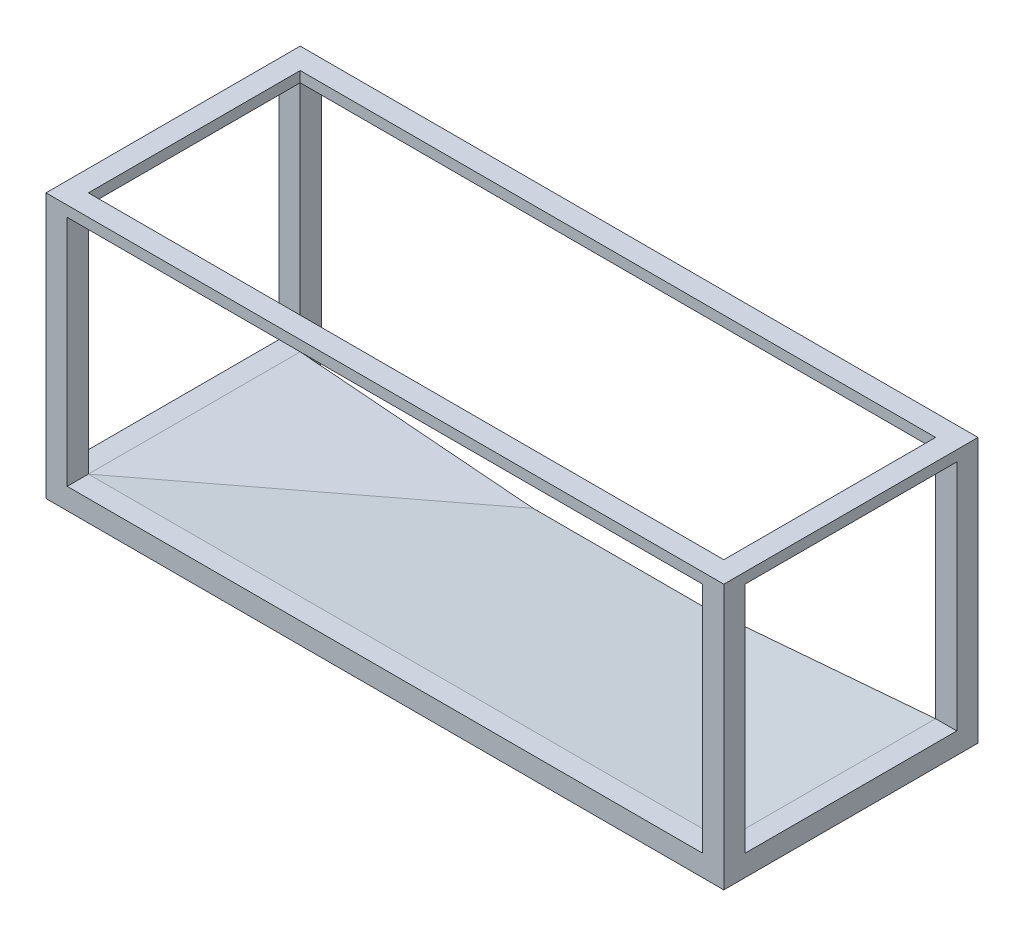
ISO-10303-21;
HEADER;
FILE_DESCRIPTION(('STEP AP214'),'2;1');
FILE_NAME('part.step','',(''),(''),'','','');
FILE_SCHEMA(('AUTOMOTIVE_DESIGN { 1 0 10303 214 1 1 1 1 }'));
ENDSEC;
DATA;
#1=APPLICATION_CONTEXT('core data for automotive mechanical design processes');
#2=APPLICATION_PROTOCOL_DEFINITION('international standard','automotive_design',2000,#1);
#3=PRODUCT_CONTEXT('',#1,'mechanical');
#4=PRODUCT('Part','Part','',(#3));
#5=PRODUCT_RELATED_PRODUCT_CATEGORY('part','',(#4));
#6=PRODUCT_DEFINITION_FORMATION('','',#4);
#7=PRODUCT_DEFINITION_CONTEXT('part definition',#1,'design');
#8=PRODUCT_DEFINITION('design','',#6,#7);
#9=PRODUCT_DEFINITION_SHAPE('','',#8);
#10=(LENGTH_UNIT() NAMED_UNIT(*) SI_UNIT(.MILLI.,.METRE.));
#11=(NAMED_UNIT(*) PLANE_ANGLE_UNIT() SI_UNIT($,.RADIAN.));
#12=(NAMED_UNIT(*) SI_UNIT($,.STERADIAN.) SOLID_ANGLE_UNIT());
#13=UNCERTAINTY_MEASURE_WITH_UNIT(LENGTH_MEASURE(1.E-05),#10,'distance_accuracy_value','');
#14=(GEOMETRIC_REPRESENTATION_CONTEXT(3) GLOBAL_UNCERTAINTY_ASSIGNED_CONTEXT((#13)) GLOBAL_UNIT_ASSIGNED_CONTEXT((#10,
#11,#12)) REPRESENTATION_CONTEXT('',''));
#15=CARTESIAN_POINT('',(0.,0.,0.));
#16=DIRECTION('',(0.,0.,1.));
#17=DIRECTION('',(1.,0.,0.));
#18=AXIS2_PLACEMENT_3D('',#15,#16,#17);
#19=CARTESIAN_POINT('',(-190.5,12.7,63.5));
#20=DIRECTION('',(1.,0.,0.));
#21=DIRECTION('',(0.,0.,-1.));
#22=AXIS2_PLACEMENT_3D('',#19,#20,#21);
#23=PLANE('',#22);
#24=DIRECTION('',(0.,-1.,0.));
#25=VECTOR('',#24,1.);
#26=CARTESIAN_POINT('',(-190.5,158.75,-63.5));
#27=LINE('',#26,#25);
#28=CARTESIAN_POINT('',(-190.5,152.4,-63.5));
#29=VERTEX_POINT('',#28);
#30=CARTESIAN_POINT('',(-190.5,12.7,-63.5));
#31=VERTEX_POINT('',#30);
#32=EDGE_CURVE('E214',#29,#31,#27,.T.);
#33=ORIENTED_EDGE('',*,*,#32,.T.);
#34=DIRECTION('',(0.,1.,0.));
#35=VECTOR('',#34,1.);
#36=CARTESIAN_POINT('',(-190.5,12.7,-63.4999999999999));
#37=LINE('',#36,#35);
#38=CARTESIAN_POINT('',(-190.5,0.,-63.4999999999999));
#39=VERTEX_POINT('',#38);
#40=EDGE_CURVE('E198',#39,#31,#37,.T.);
#41=ORIENTED_EDGE('',*,*,#40,.F.);
#42=DIRECTION('',(0.,0.,1.));
#43=VECTOR('',#42,1.);
#44=CARTESIAN_POINT('',(-190.5,0.,63.5));
#45=LINE('',#44,#43);
#46=CARTESIAN_POINT('',(-190.5,0.,-76.2));
#47=VERTEX_POINT('',#46);
#48=EDGE_CURVE('E336',#47,#39,#45,.T.);
#49=ORIENTED_EDGE('',*,*,#48,.F.);
#50=DIRECTION('',(0.,-1.,0.));
#51=VECTOR('',#50,1.);
#52=CARTESIAN_POINT('',(-190.5,158.75,-76.2));
#53=LINE('',#52,#51);
#54=CARTESIAN_POINT('',(-190.5,152.4,-76.2));
#55=VERTEX_POINT('',#54);
#56=EDGE_CURVE('E266',#55,#47,#53,.T.);
#57=ORIENTED_EDGE('',*,*,#56,.F.);
#58=DIRECTION('',(0.,0.,1.));
#59=VECTOR('',#58,1.);
#60=CARTESIAN_POINT('',(-190.5,152.4,0.));
#61=LINE('',#60,#59);
#62=EDGE_CURVE('E216',#55,#29,#61,.T.);
#63=ORIENTED_EDGE('',*,*,#62,.T.);
#64=EDGE_LOOP('',(#33,#41,#49,#57,#63));
#65=FACE_BOUND('',#64,.T.);
#66=ADVANCED_FACE('F61',(#65),#23,.T.);
#67=CARTESIAN_POINT('',(190.5,12.7,63.5));
#68=DIRECTION('',(-1.,0.,0.));
#69=DIRECTION('',(0.,0.,1.));
#70=AXIS2_PLACEMENT_3D('',#67,#68,#69);
#71=PLANE('',#70);
#72=DIRECTION('',(0.,0.,-1.));
#73=VECTOR('',#72,1.);
#74=CARTESIAN_POINT('',(190.5,0.,63.5));
#75=LINE('',#74,#73);
#76=CARTESIAN_POINT('',(190.5,0.,-63.5000000000001));
#77=VERTEX_POINT('',#76);
#78=CARTESIAN_POINT('',(190.5,0.,-76.2));
#79=VERTEX_POINT('',#78);
#80=EDGE_CURVE('E253',#77,#79,#75,.T.);
#81=ORIENTED_EDGE('',*,*,#80,.F.);
#82=DIRECTION('',(0.,-1.,0.));
#83=VECTOR('',#82,1.);
#84=CARTESIAN_POINT('',(190.5,12.7,-63.5));
#85=LINE('',#84,#83);
#86=CARTESIAN_POINT('',(190.5,12.7,-63.5));
#87=VERTEX_POINT('',#86);
#88=EDGE_CURVE('E211',#87,#77,#85,.T.);
#89=ORIENTED_EDGE('',*,*,#88,.F.);
#90=DIRECTION('',(0.,-1.,0.));
#91=VECTOR('',#90,1.);
#92=CARTESIAN_POINT('',(190.5,158.75,-63.5));
#93=LINE('',#92,#91);
#94=CARTESIAN_POINT('',(190.5,152.4,-63.5));
#95=VERTEX_POINT('',#94);
#96=EDGE_CURVE('E314',#95,#87,#93,.T.);
#97=ORIENTED_EDGE('',*,*,#96,.F.);
#98=DIRECTION('',(0.,0.,1.));
#99=VECTOR('',#98,1.);
#100=CARTESIAN_POINT('',(190.5,152.4,0.));
#101=LINE('',#100,#99);
#102=CARTESIAN_POINT('',(190.5,152.4,-76.2));
#103=VERTEX_POINT('',#102);
#104=EDGE_CURVE('E487',#103,#95,#101,.T.);
#105=ORIENTED_EDGE('',*,*,#104,.F.);
#106=DIRECTION('',(0.,-1.,0.));
#107=VECTOR('',#106,1.);
#108=CARTESIAN_POINT('',(190.5,158.75,-76.2));
#109=LINE('',#108,#107);
#110=EDGE_CURVE('E399',#103,#79,#109,.T.);
#111=ORIENTED_EDGE('',*,*,#110,.T.);
#112=EDGE_LOOP('',(#81,#89,#97,#105,#111));
#113=FACE_BOUND('',#112,.T.);
#114=ADVANCED_FACE('F591',(#113),#71,.T.);
#115=CARTESIAN_POINT('',(0.,12.7,0.));
#116=DIRECTION('',(0.,-1.,0.));
#117=DIRECTION('',(0.,0.,-1.));
#118=AXIS2_PLACEMENT_3D('',#115,#116,#117);
#119=PLANE('',#118);
#120=DIRECTION('',(1.,0.,0.));
#121=VECTOR('',#120,1.);
#122=CARTESIAN_POINT('',(0.,12.7,-63.5));
#123=LINE('',#122,#121);
#124=CARTESIAN_POINT('',(203.2,12.7,-63.5));
#125=VERTEX_POINT('',#124);
#126=EDGE_CURVE('E395',#87,#125,#123,.T.);
#127=ORIENTED_EDGE('',*,*,#126,.F.);
#128=DIRECTION('',(0.,0.,-1.));
#129=VECTOR('',#128,1.);
#130=CARTESIAN_POINT('',(190.5,12.7,63.5));
#131=LINE('',#130,#129);
#132=CARTESIAN_POINT('',(190.5,12.7,63.5));
#133=VERTEX_POINT('',#132);
#134=EDGE_CURVE('E236',#133,#87,#131,.T.);
#135=ORIENTED_EDGE('',*,*,#134,.F.);
#136=DIRECTION('',(1.,0.,0.));
#137=VECTOR('',#136,1.);
#138=CARTESIAN_POINT('',(0.,12.7,63.5));
#139=LINE('',#138,#137);
#140=CARTESIAN_POINT('',(203.2,12.7,63.5));
#141=VERTEX_POINT('',#140);
#142=EDGE_CURVE('E298',#133,#141,#139,.T.);
#143=ORIENTED_EDGE('',*,*,#142,.T.);
#144=DIRECTION('',(0.,0.,-1.));
#145=VECTOR('',#144,1.);
#146=CARTESIAN_POINT('',(203.2,12.7,76.2));
#147=LINE('',#146,#145);
#148=EDGE_CURVE('E353',#141,#125,#147,.T.);
#149=ORIENTED_EDGE('',*,*,#148,.T.);
#150=EDGE_LOOP('',(#127,#135,#143,#149));
#151=FACE_BOUND('',#150,.T.);
#152=ADVANCED_FACE('F595',(#151),#119,.F.);
#153=DIRECTION('',(0.,0.,1.));
#154=VECTOR('',#153,1.);
#155=CARTESIAN_POINT('',(190.5,12.7,0.));
#156=LINE('',#155,#154);
#157=CARTESIAN_POINT('',(190.5,12.7,76.2));
#158=VERTEX_POINT('',#157);
#159=EDGE_CURVE('E308',#133,#158,#156,.T.);
#160=ORIENTED_EDGE('',*,*,#159,.F.);
#161=DIRECTION('',(1.,0.,0.));
#162=VECTOR('',#161,1.);
#163=CARTESIAN_POINT('',(-190.5,12.7,63.5));
#164=LINE('',#163,#162);
#165=CARTESIAN_POINT('',(-190.5,12.7,63.5));
#166=VERTEX_POINT('',#165);
#167=EDGE_CURVE('E235',#166,#133,#164,.T.);
#168=ORIENTED_EDGE('',*,*,#167,.F.);
#169=DIRECTION('',(0.,0.,1.));
#170=VECTOR('',#169,1.);
#171=CARTESIAN_POINT('',(-190.5,12.7,0.));
#172=LINE('',#171,#170);
#173=CARTESIAN_POINT('',(-190.5,12.7,76.2));
#174=VERTEX_POINT('',#173);
#175=EDGE_CURVE('E260',#166,#174,#172,.T.);
#176=ORIENTED_EDGE('',*,*,#175,.T.);
#177=DIRECTION('',(1.,0.,0.));
#178=VECTOR('',#177,1.);
#179=CARTESIAN_POINT('',(-203.2,12.7,76.2));
#180=LINE('',#179,#178);
#181=EDGE_CURVE('E348',#174,#158,#180,.T.);
#182=ORIENTED_EDGE('',*,*,#181,.T.);
#183=EDGE_LOOP('',(#160,#168,#176,#182));
#184=FACE_BOUND('',#183,.T.);
#185=ADVANCED_FACE('F547',(#184),#119,.F.);
#186=DIRECTION('',(0.,0.,1.));
#187=VECTOR('',#186,1.);
#188=CARTESIAN_POINT('',(-190.5,12.7,-63.4999999999999));
#189=LINE('',#188,#187);
#190=EDGE_CURVE('E195',#31,#166,#189,.T.);
#191=ORIENTED_EDGE('',*,*,#190,.F.);
#192=DIRECTION('',(-1.,0.,0.));
#193=VECTOR('',#192,1.);
#194=CARTESIAN_POINT('',(0.,12.7,-63.5));
#195=LINE('',#194,#193);
#196=CARTESIAN_POINT('',(-203.2,12.7,-63.4999999999999));
#197=VERTEX_POINT('',#196);
#198=EDGE_CURVE('E229',#31,#197,#195,.T.);
#199=ORIENTED_EDGE('',*,*,#198,.T.);
#200=DIRECTION('',(0.,0.,1.));
#201=VECTOR('',#200,1.);
#202=CARTESIAN_POINT('',(-203.2,12.7,76.2));
#203=LINE('',#202,#201);
#204=CARTESIAN_POINT('',(-203.2,12.7,63.5));
#205=VERTEX_POINT('',#204);
#206=EDGE_CURVE('E345',#197,#205,#203,.T.);
#207=ORIENTED_EDGE('',*,*,#206,.T.);
#208=DIRECTION('',(-1.,0.,0.));
#209=VECTOR('',#208,1.);
#210=CARTESIAN_POINT('',(0.,12.7,63.5));
#211=LINE('',#210,#209);
#212=EDGE_CURVE('E232',#166,#205,#211,.T.);
#213=ORIENTED_EDGE('',*,*,#212,.F.);
#214=EDGE_LOOP('',(#191,#199,#207,#213));
#215=FACE_BOUND('',#214,.T.);
#216=ADVANCED_FACE('F227',(#215),#119,.F.);
#217=CARTESIAN_POINT('',(0.,0.,0.));
#218=DIRECTION('',(0.,-1.,0.));
#219=DIRECTION('',(0.,0.,-1.));
#220=AXIS2_PLACEMENT_3D('',#217,#218,#219);
#221=PLANE('',#220);
#222=ORIENTED_EDGE('',*,*,#48,.T.);
#223=DIRECTION('',(1.,0.,0.));
#224=VECTOR('',#223,1.);
#225=CARTESIAN_POINT('',(-318.133420388235,0.,-63.5));
#226=LINE('',#225,#224);
#227=EDGE_CURVE('E79',#39,#77,#226,.T.);
#228=ORIENTED_EDGE('',*,*,#227,.T.);
#229=ORIENTED_EDGE('',*,*,#80,.T.);
#230=DIRECTION('',(-1.,0.,0.));
#231=VECTOR('',#230,1.);
#232=CARTESIAN_POINT('',(-203.2,0.,-76.2));
#233=LINE('',#232,#231);
#234=CARTESIAN_POINT('',(203.2,0.,-76.2));
#235=VERTEX_POINT('',#234);
#236=EDGE_CURVE('E349',#235,#79,#233,.T.);
#237=ORIENTED_EDGE('',*,*,#236,.F.);
#238=DIRECTION('',(0.,0.,-1.));
#239=VECTOR('',#238,1.);
#240=CARTESIAN_POINT('',(203.2,0.,76.2));
#241=LINE('',#240,#239);
#242=CARTESIAN_POINT('',(203.2,0.,76.2));
#243=VERTEX_POINT('',#242);
#244=EDGE_CURVE('E365',#243,#235,#241,.T.);
#245=ORIENTED_EDGE('',*,*,#244,.F.);
#246=DIRECTION('',(1.,0.,0.));
#247=VECTOR('',#246,1.);
#248=CARTESIAN_POINT('',(-203.2,0.,76.2));
#249=LINE('',#248,#247);
#250=CARTESIAN_POINT('',(-203.2,0.,76.2));
#251=VERTEX_POINT('',#250);
#252=EDGE_CURVE('E361',#251,#243,#249,.T.);
#253=ORIENTED_EDGE('',*,*,#252,.F.);
#254=DIRECTION('',(0.,0.,1.));
#255=VECTOR('',#254,1.);
#256=CARTESIAN_POINT('',(-203.2,0.,76.2));
#257=LINE('',#256,#255);
#258=CARTESIAN_POINT('',(-203.2,0.,-76.2));
#259=VERTEX_POINT('',#258);
#260=EDGE_CURVE('E325',#259,#251,#257,.T.);
#261=ORIENTED_EDGE('',*,*,#260,.F.);
#262=EDGE_CURVE('E369',#47,#259,#233,.T.);
#263=ORIENTED_EDGE('',*,*,#262,.F.);
#264=EDGE_LOOP('',(#222,#228,#229,#237,#245,#253,#261,#263));
#265=FACE_BOUND('',#264,.T.);
#266=ADVANCED_FACE('F607',(#265),#221,.T.);
#267=CARTESIAN_POINT('',(-203.2,12.7,76.2));
#268=DIRECTION('',(1.,0.,0.));
#269=DIRECTION('',(0.,0.,-1.));
#270=AXIS2_PLACEMENT_3D('',#267,#268,#269);
#271=PLANE('',#270);
#272=DIRECTION('',(0.,0.,1.));
#273=VECTOR('',#272,1.);
#274=CARTESIAN_POINT('',(-203.2,152.4,76.2));
#275=LINE('',#274,#273);
#276=CARTESIAN_POINT('',(-203.2,152.4,-63.5));
#277=VERTEX_POINT('',#276);
#278=CARTESIAN_POINT('',(-203.2,152.4,63.5));
#279=VERTEX_POINT('',#278);
#280=EDGE_CURVE('E462',#277,#279,#275,.T.);
#281=ORIENTED_EDGE('',*,*,#280,.T.);
#282=DIRECTION('',(0.,-1.,0.));
#283=VECTOR('',#282,1.);
#284=CARTESIAN_POINT('',(-203.2,158.75,63.5));
#285=LINE('',#284,#283);
#286=EDGE_CURVE('E254',#279,#205,#285,.T.);
#287=ORIENTED_EDGE('',*,*,#286,.T.);
#288=ORIENTED_EDGE('',*,*,#206,.F.);
#289=DIRECTION('',(0.,-1.,0.));
#290=VECTOR('',#289,1.);
#291=CARTESIAN_POINT('',(-203.2,158.75,-63.5));
#292=LINE('',#291,#290);
#293=EDGE_CURVE('E221',#277,#197,#292,.T.);
#294=ORIENTED_EDGE('',*,*,#293,.F.);
#295=EDGE_LOOP('',(#281,#287,#288,#294));
#296=FACE_BOUND('',#295,.T.);
#297=ORIENTED_EDGE('',*,*,#260,.T.);
#298=DIRECTION('',(0.,-1.,0.));
#299=VECTOR('',#298,1.);
#300=CARTESIAN_POINT('',(-203.2,12.7,76.2));
#301=LINE('',#300,#299);
#302=CARTESIAN_POINT('',(-203.2,158.75,76.2));
#303=VERTEX_POINT('',#302);
#304=EDGE_CURVE('E382',#303,#251,#301,.T.);
#305=ORIENTED_EDGE('',*,*,#304,.F.);
#306=DIRECTION('',(0.,0.,1.));
#307=VECTOR('',#306,1.);
#308=CARTESIAN_POINT('',(-203.2,158.75,0.));
#309=LINE('',#308,#307);
#310=CARTESIAN_POINT('',(-203.2,158.75,-76.2));
#311=VERTEX_POINT('',#310);
#312=EDGE_CURVE('E259',#311,#303,#309,.T.);
#313=ORIENTED_EDGE('',*,*,#312,.F.);
#314=DIRECTION('',(0.,-1.,0.));
#315=VECTOR('',#314,1.);
#316=CARTESIAN_POINT('',(-203.2,12.7,-76.2));
#317=LINE('',#316,#315);
#318=EDGE_CURVE('E357',#311,#259,#317,.T.);
#319=ORIENTED_EDGE('',*,*,#318,.T.);
#320=EDGE_LOOP('',(#297,#305,#313,#319));
#321=FACE_BOUND('',#320,.T.);
#322=ADVANCED_FACE('F63',(#296,#321),#271,.F.);
#323=CARTESIAN_POINT('',(-203.2,12.7,76.2));
#324=DIRECTION('',(0.,0.,-1.));
#325=DIRECTION('',(-1.,0.,0.));
#326=AXIS2_PLACEMENT_3D('',#323,#324,#325);
#327=PLANE('',#326);
#328=DIRECTION('',(1.,0.,0.));
#329=VECTOR('',#328,1.);
#330=CARTESIAN_POINT('',(-203.2,152.4,76.2));
#331=LINE('',#330,#329);
#332=CARTESIAN_POINT('',(-190.5,152.4,76.2));
#333=VERTEX_POINT('',#332);
#334=CARTESIAN_POINT('',(190.5,152.4,76.2));
#335=VERTEX_POINT('',#334);
#336=EDGE_CURVE('E475',#333,#335,#331,.T.);
#337=ORIENTED_EDGE('',*,*,#336,.T.);
#338=DIRECTION('',(0.,-1.,0.));
#339=VECTOR('',#338,1.);
#340=CARTESIAN_POINT('',(190.5,158.75,76.2));
#341=LINE('',#340,#339);
#342=EDGE_CURVE('E240',#335,#158,#341,.T.);
#343=ORIENTED_EDGE('',*,*,#342,.T.);
#344=ORIENTED_EDGE('',*,*,#181,.F.);
#345=DIRECTION('',(0.,-1.,0.));
#346=VECTOR('',#345,1.);
#347=CARTESIAN_POINT('',(-190.5,158.75,76.2));
#348=LINE('',#347,#346);
#349=EDGE_CURVE('E529',#333,#174,#348,.T.);
#350=ORIENTED_EDGE('',*,*,#349,.F.);
#351=EDGE_LOOP('',(#337,#343,#344,#350));
#352=FACE_BOUND('',#351,.T.);
#353=ORIENTED_EDGE('',*,*,#252,.T.);
#354=DIRECTION('',(0.,-1.,0.));
#355=VECTOR('',#354,1.);
#356=CARTESIAN_POINT('',(203.2,12.7,76.2));
#357=LINE('',#356,#355);
#358=CARTESIAN_POINT('',(203.2,158.75,76.2));
#359=VERTEX_POINT('',#358);
#360=EDGE_CURVE('E379',#359,#243,#357,.T.);
#361=ORIENTED_EDGE('',*,*,#360,.F.);
#362=DIRECTION('',(1.,0.,0.));
#363=VECTOR('',#362,1.);
#364=CARTESIAN_POINT('',(0.,158.75,76.2));
#365=LINE('',#364,#363);
#366=EDGE_CURVE('E526',#303,#359,#365,.T.);
#367=ORIENTED_EDGE('',*,*,#366,.F.);
#368=ORIENTED_EDGE('',*,*,#304,.T.);
#369=EDGE_LOOP('',(#353,#361,#367,#368));
#370=FACE_BOUND('',#369,.T.);
#371=ADVANCED_FACE('F549',(#352,#370),#327,.F.);
#372=CARTESIAN_POINT('',(203.2,12.7,76.2));
#373=DIRECTION('',(-1.,0.,0.));
#374=DIRECTION('',(0.,0.,1.));
#375=AXIS2_PLACEMENT_3D('',#372,#373,#374);
#376=PLANE('',#375);
#377=DIRECTION('',(0.,0.,-1.));
#378=VECTOR('',#377,1.);
#379=CARTESIAN_POINT('',(203.2,152.4,76.2));
#380=LINE('',#379,#378);
#381=CARTESIAN_POINT('',(203.2,152.4,63.5));
#382=VERTEX_POINT('',#381);
#383=CARTESIAN_POINT('',(203.2,152.4,-63.5));
#384=VERTEX_POINT('',#383);
#385=EDGE_CURVE('E479',#382,#384,#380,.T.);
#386=ORIENTED_EDGE('',*,*,#385,.T.);
#387=DIRECTION('',(0.,-1.,0.));
#388=VECTOR('',#387,1.);
#389=CARTESIAN_POINT('',(203.2,158.75,-63.5));
#390=LINE('',#389,#388);
#391=EDGE_CURVE('E394',#384,#125,#390,.T.);
#392=ORIENTED_EDGE('',*,*,#391,.T.);
#393=ORIENTED_EDGE('',*,*,#148,.F.);
#394=DIRECTION('',(0.,-1.,0.));
#395=VECTOR('',#394,1.);
#396=CARTESIAN_POINT('',(203.2,158.75,63.5));
#397=LINE('',#396,#395);
#398=EDGE_CURVE('E245',#382,#141,#397,.T.);
#399=ORIENTED_EDGE('',*,*,#398,.F.);
#400=EDGE_LOOP('',(#386,#392,#393,#399));
#401=FACE_BOUND('',#400,.T.);
#402=ORIENTED_EDGE('',*,*,#244,.T.);
#403=DIRECTION('',(0.,-1.,0.));
#404=VECTOR('',#403,1.);
#405=CARTESIAN_POINT('',(203.2,12.7,-76.2));
#406=LINE('',#405,#404);
#407=CARTESIAN_POINT('',(203.2,158.75,-76.2));
#408=VERTEX_POINT('',#407);
#409=EDGE_CURVE('E376',#408,#235,#406,.T.);
#410=ORIENTED_EDGE('',*,*,#409,.F.);
#411=DIRECTION('',(0.,0.,1.));
#412=VECTOR('',#411,1.);
#413=CARTESIAN_POINT('',(203.2,158.75,0.));
#414=LINE('',#413,#412);
#415=EDGE_CURVE('E307',#408,#359,#414,.T.);
#416=ORIENTED_EDGE('',*,*,#415,.T.);
#417=ORIENTED_EDGE('',*,*,#360,.T.);
#418=EDGE_LOOP('',(#402,#410,#416,#417));
#419=FACE_BOUND('',#418,.T.);
#420=ADVANCED_FACE('F618',(#401,#419),#376,.F.);
#421=CARTESIAN_POINT('',(-203.2,12.7,-76.2));
#422=DIRECTION('',(0.,0.,1.));
#423=DIRECTION('',(1.,0.,0.));
#424=AXIS2_PLACEMENT_3D('',#421,#422,#423);
#425=PLANE('',#424);
#426=ORIENTED_EDGE('',*,*,#236,.T.);
#427=ORIENTED_EDGE('',*,*,#110,.F.);
#428=DIRECTION('',(-1.,0.,0.));
#429=VECTOR('',#428,1.);
#430=CARTESIAN_POINT('',(-203.2,152.4,-76.2));
#431=LINE('',#430,#429);
#432=EDGE_CURVE('E483',#103,#55,#431,.T.);
#433=ORIENTED_EDGE('',*,*,#432,.T.);
#434=ORIENTED_EDGE('',*,*,#56,.T.);
#435=ORIENTED_EDGE('',*,*,#262,.T.);
#436=ORIENTED_EDGE('',*,*,#318,.F.);
#437=DIRECTION('',(1.,0.,0.));
#438=VECTOR('',#437,1.);
#439=CARTESIAN_POINT('',(0.,158.75,-76.2));
#440=LINE('',#439,#438);
#441=EDGE_CURVE('E222',#311,#408,#440,.T.);
#442=ORIENTED_EDGE('',*,*,#441,.T.);
#443=ORIENTED_EDGE('',*,*,#409,.T.);
#444=EDGE_LOOP('',(#426,#427,#433,#434,#435,#436,#442,#443));
#445=FACE_BOUND('',#444,.T.);
#446=ADVANCED_FACE('F602',(#445),#425,.F.);
#447=CARTESIAN_POINT('',(-190.5,158.75,0.));
#448=DIRECTION('',(1.,0.,0.));
#449=DIRECTION('',(0.,0.,-1.));
#450=AXIS2_PLACEMENT_3D('',#447,#448,#449);
#451=PLANE('',#450);
#452=DIRECTION('',(0.,0.,-1.));
#453=VECTOR('',#452,1.);
#454=CARTESIAN_POINT('',(-190.5,152.4,0.));
#455=LINE('',#454,#453);
#456=CARTESIAN_POINT('',(-190.5,152.4,63.5));
#457=VERTEX_POINT('',#456);
#458=EDGE_CURVE('E400',#333,#457,#455,.T.);
#459=ORIENTED_EDGE('',*,*,#458,.F.);
#460=ORIENTED_EDGE('',*,*,#349,.T.);
#461=ORIENTED_EDGE('',*,*,#175,.F.);
#462=DIRECTION('',(0.,-1.,0.));
#463=VECTOR('',#462,1.);
#464=CARTESIAN_POINT('',(-190.5,158.75,63.5));
#465=LINE('',#464,#463);
#466=EDGE_CURVE('E249',#457,#166,#465,.T.);
#467=ORIENTED_EDGE('',*,*,#466,.F.);
#468=EDGE_LOOP('',(#459,#460,#461,#467));
#469=FACE_BOUND('',#468,.T.);
#470=ADVANCED_FACE('F542',(#469),#451,.T.);
#471=CARTESIAN_POINT('',(0.,158.75,63.5));
#472=DIRECTION('',(0.,0.,1.));
#473=DIRECTION('',(1.,0.,0.));
#474=AXIS2_PLACEMENT_3D('',#471,#472,#473);
#475=PLANE('',#474);
#476=ORIENTED_EDGE('',*,*,#286,.F.);
#477=DIRECTION('',(1.,0.,0.));
#478=VECTOR('',#477,1.);
#479=CARTESIAN_POINT('',(0.,152.4,63.5));
#480=LINE('',#479,#478);
#481=EDGE_CURVE('E502',#279,#457,#480,.T.);
#482=ORIENTED_EDGE('',*,*,#481,.T.);
#483=ORIENTED_EDGE('',*,*,#466,.T.);
#484=ORIENTED_EDGE('',*,*,#212,.T.);
#485=EDGE_LOOP('',(#476,#482,#483,#484));
#486=FACE_BOUND('',#485,.T.);
#487=ADVANCED_FACE('F537',(#486),#475,.F.);
#488=CARTESIAN_POINT('',(0.,158.75,0.));
#489=DIRECTION('',(0.,1.,0.));
#490=DIRECTION('',(0.,0.,1.));
#491=AXIS2_PLACEMENT_3D('',#488,#489,#490);
#492=PLANE('',#491);
#493=ORIENTED_EDGE('',*,*,#366,.T.);
#494=ORIENTED_EDGE('',*,*,#415,.F.);
#495=ORIENTED_EDGE('',*,*,#441,.F.);
#496=ORIENTED_EDGE('',*,*,#312,.T.);
#497=EDGE_LOOP('',(#493,#494,#495,#496));
#498=FACE_BOUND('',#497,.T.);
#499=DIRECTION('',(1.,0.,0.));
#500=VECTOR('',#499,1.);
#501=CARTESIAN_POINT('',(-190.5,158.75,63.5));
#502=LINE('',#501,#500);
#503=CARTESIAN_POINT('',(-190.5,158.75,63.5));
#504=VERTEX_POINT('',#503);
#505=CARTESIAN_POINT('',(190.5,158.75,63.5));
#506=VERTEX_POINT('',#505);
#507=EDGE_CURVE('E403',#504,#506,#502,.T.);
#508=ORIENTED_EDGE('',*,*,#507,.F.);
#509=DIRECTION('',(0.,0.,1.));
#510=VECTOR('',#509,1.);
#511=CARTESIAN_POINT('',(-190.5,158.75,63.5));
#512=LINE('',#511,#510);
#513=CARTESIAN_POINT('',(-190.5,158.75,-63.5));
#514=VERTEX_POINT('',#513);
#515=EDGE_CURVE('E433',#514,#504,#512,.T.);
#516=ORIENTED_EDGE('',*,*,#515,.F.);
#517=DIRECTION('',(-1.,0.,0.));
#518=VECTOR('',#517,1.);
#519=CARTESIAN_POINT('',(-190.5,158.75,-63.5));
#520=LINE('',#519,#518);
#521=CARTESIAN_POINT('',(190.5,158.75,-63.5));
#522=VERTEX_POINT('',#521);
#523=EDGE_CURVE('E452',#522,#514,#520,.T.);
#524=ORIENTED_EDGE('',*,*,#523,.F.);
#525=DIRECTION('',(0.,0.,-1.));
#526=VECTOR('',#525,1.);
#527=CARTESIAN_POINT('',(190.5,158.75,63.5));
#528=LINE('',#527,#526);
#529=EDGE_CURVE('E448',#506,#522,#528,.T.);
#530=ORIENTED_EDGE('',*,*,#529,.F.);
#531=EDGE_LOOP('',(#508,#516,#524,#530));
#532=FACE_BOUND('',#531,.T.);
#533=ADVANCED_FACE('F613',(#498,#532),#492,.T.);
#534=CARTESIAN_POINT('',(0.,158.75,-63.5));
#535=DIRECTION('',(0.,0.,1.));
#536=DIRECTION('',(1.,0.,0.));
#537=AXIS2_PLACEMENT_3D('',#534,#535,#536);
#538=PLANE('',#537);
#539=DIRECTION('',(1.,0.,0.));
#540=VECTOR('',#539,1.);
#541=CARTESIAN_POINT('',(0.,152.4,-63.5));
#542=LINE('',#541,#540);
#543=EDGE_CURVE('E497',#277,#29,#542,.T.);
#544=ORIENTED_EDGE('',*,*,#543,.F.);
#545=ORIENTED_EDGE('',*,*,#293,.T.);
#546=ORIENTED_EDGE('',*,*,#198,.F.);
#547=ORIENTED_EDGE('',*,*,#32,.F.);
#548=EDGE_LOOP('',(#544,#545,#546,#547));
#549=FACE_BOUND('',#548,.T.);
#550=ADVANCED_FACE('F237',(#549),#538,.T.);
#551=CARTESIAN_POINT('',(190.5,158.75,0.));
#552=DIRECTION('',(1.,0.,0.));
#553=DIRECTION('',(0.,0.,-1.));
#554=AXIS2_PLACEMENT_3D('',#551,#552,#553);
#555=PLANE('',#554);
#556=ORIENTED_EDGE('',*,*,#342,.F.);
#557=DIRECTION('',(0.,0.,-1.));
#558=VECTOR('',#557,1.);
#559=CARTESIAN_POINT('',(190.5,152.4,0.));
#560=LINE('',#559,#558);
#561=CARTESIAN_POINT('',(190.5,152.4,63.5));
#562=VERTEX_POINT('',#561);
#563=EDGE_CURVE('E494',#335,#562,#560,.T.);
#564=ORIENTED_EDGE('',*,*,#563,.T.);
#565=DIRECTION('',(0.,-1.,0.));
#566=VECTOR('',#565,1.);
#567=CARTESIAN_POINT('',(190.5,158.75,63.5));
#568=LINE('',#567,#566);
#569=EDGE_CURVE('E317',#562,#133,#568,.T.);
#570=ORIENTED_EDGE('',*,*,#569,.T.);
#571=ORIENTED_EDGE('',*,*,#159,.T.);
#572=EDGE_LOOP('',(#556,#564,#570,#571));
#573=FACE_BOUND('',#572,.T.);
#574=ADVANCED_FACE('F553',(#573),#555,.F.);
#575=CARTESIAN_POINT('',(0.,158.75,63.5));
#576=DIRECTION('',(0.,0.,-1.));
#577=DIRECTION('',(-1.,0.,0.));
#578=AXIS2_PLACEMENT_3D('',#575,#576,#577);
#579=PLANE('',#578);
#580=DIRECTION('',(-1.,0.,0.));
#581=VECTOR('',#580,1.);
#582=CARTESIAN_POINT('',(0.,152.4,63.5));
#583=LINE('',#582,#581);
#584=EDGE_CURVE('E490',#382,#562,#583,.T.);
#585=ORIENTED_EDGE('',*,*,#584,.F.);
#586=ORIENTED_EDGE('',*,*,#398,.T.);
#587=ORIENTED_EDGE('',*,*,#142,.F.);
#588=ORIENTED_EDGE('',*,*,#569,.F.);
#589=EDGE_LOOP('',(#585,#586,#587,#588));
#590=FACE_BOUND('',#589,.T.);
#591=ADVANCED_FACE('F883',(#590),#579,.T.);
#592=CARTESIAN_POINT('',(0.,158.75,-63.5));
#593=DIRECTION('',(0.,0.,-1.));
#594=DIRECTION('',(-1.,0.,0.));
#595=AXIS2_PLACEMENT_3D('',#592,#593,#594);
#596=PLANE('',#595);
#597=ORIENTED_EDGE('',*,*,#391,.F.);
#598=DIRECTION('',(-1.,0.,0.));
#599=VECTOR('',#598,1.);
#600=CARTESIAN_POINT('',(0.,152.4,-63.5));
#601=LINE('',#600,#599);
#602=EDGE_CURVE('E385',#384,#95,#601,.T.);
#603=ORIENTED_EDGE('',*,*,#602,.T.);
#604=ORIENTED_EDGE('',*,*,#96,.T.);
#605=ORIENTED_EDGE('',*,*,#126,.T.);
#606=EDGE_LOOP('',(#597,#603,#604,#605));
#607=FACE_BOUND('',#606,.T.);
#608=ADVANCED_FACE('F586',(#607),#596,.F.);
#609=CARTESIAN_POINT('',(0.,152.4,0.));
#610=DIRECTION('',(0.,-1.,0.));
#611=DIRECTION('',(0.,0.,-1.));
#612=AXIS2_PLACEMENT_3D('',#609,#610,#611);
#613=PLANE('',#612);
#614=ORIENTED_EDGE('',*,*,#481,.F.);
#615=ORIENTED_EDGE('',*,*,#280,.F.);
#616=ORIENTED_EDGE('',*,*,#543,.T.);
#617=DIRECTION('',(0.,0.,1.));
#618=VECTOR('',#617,1.);
#619=CARTESIAN_POINT('',(-190.5,152.4,63.5));
#620=LINE('',#619,#618);
#621=EDGE_CURVE('E441',#29,#457,#620,.T.);
#622=ORIENTED_EDGE('',*,*,#621,.T.);
#623=EDGE_LOOP('',(#614,#615,#616,#622));
#624=FACE_BOUND('',#623,.T.);
#625=ADVANCED_FACE('F565',(#624),#613,.T.);
#626=ORIENTED_EDGE('',*,*,#62,.F.);
#627=ORIENTED_EDGE('',*,*,#432,.F.);
#628=ORIENTED_EDGE('',*,*,#104,.T.);
#629=DIRECTION('',(-1.,0.,0.));
#630=VECTOR('',#629,1.);
#631=CARTESIAN_POINT('',(-190.5,152.4,-63.5));
#632=LINE('',#631,#630);
#633=EDGE_CURVE('E437',#95,#29,#632,.T.);
#634=ORIENTED_EDGE('',*,*,#633,.T.);
#635=EDGE_LOOP('',(#626,#627,#628,#634));
#636=FACE_BOUND('',#635,.T.);
#637=ADVANCED_FACE('F571',(#636),#613,.T.);
#638=ORIENTED_EDGE('',*,*,#336,.F.);
#639=ORIENTED_EDGE('',*,*,#458,.T.);
#640=DIRECTION('',(1.,0.,0.));
#641=VECTOR('',#640,1.);
#642=CARTESIAN_POINT('',(-190.5,152.4,63.5));
#643=LINE('',#642,#641);
#644=EDGE_CURVE('E423',#457,#562,#643,.T.);
#645=ORIENTED_EDGE('',*,*,#644,.T.);
#646=ORIENTED_EDGE('',*,*,#563,.F.);
#647=EDGE_LOOP('',(#638,#639,#645,#646));
#648=FACE_BOUND('',#647,.T.);
#649=ADVANCED_FACE('F556',(#648),#613,.T.);
#650=ORIENTED_EDGE('',*,*,#385,.F.);
#651=ORIENTED_EDGE('',*,*,#584,.T.);
#652=DIRECTION('',(0.,0.,-1.));
#653=VECTOR('',#652,1.);
#654=CARTESIAN_POINT('',(190.5,152.4,63.5));
#655=LINE('',#654,#653);
#656=EDGE_CURVE('E432',#562,#95,#655,.T.);
#657=ORIENTED_EDGE('',*,*,#656,.T.);
#658=ORIENTED_EDGE('',*,*,#602,.F.);
#659=EDGE_LOOP('',(#650,#651,#657,#658));
#660=FACE_BOUND('',#659,.T.);
#661=ADVANCED_FACE('F582',(#660),#613,.T.);
#662=CARTESIAN_POINT('',(-190.5,152.4,63.5));
#663=DIRECTION('',(0.,0.,1.));
#664=DIRECTION('',(1.,0.,0.));
#665=AXIS2_PLACEMENT_3D('',#662,#663,#664);
#666=PLANE('',#665);
#667=ORIENTED_EDGE('',*,*,#507,.T.);
#668=DIRECTION('',(0.,1.,0.));
#669=VECTOR('',#668,1.);
#670=CARTESIAN_POINT('',(190.5,152.4,63.5));
#671=LINE('',#670,#669);
#672=EDGE_CURVE('E445',#562,#506,#671,.T.);
#673=ORIENTED_EDGE('',*,*,#672,.F.);
#674=ORIENTED_EDGE('',*,*,#644,.F.);
#675=DIRECTION('',(0.,1.,0.));
#676=VECTOR('',#675,1.);
#677=CARTESIAN_POINT('',(-190.5,152.4,63.5));
#678=LINE('',#677,#676);
#679=EDGE_CURVE('E459',#457,#504,#678,.T.);
#680=ORIENTED_EDGE('',*,*,#679,.T.);
#681=EDGE_LOOP('',(#667,#673,#674,#680));
#682=FACE_BOUND('',#681,.T.);
#683=ADVANCED_FACE('F561',(#682),#666,.F.);
#684=CARTESIAN_POINT('',(-190.5,152.4,63.5));
#685=DIRECTION('',(-1.,0.,0.));
#686=DIRECTION('',(0.,0.,1.));
#687=AXIS2_PLACEMENT_3D('',#684,#685,#686);
#688=PLANE('',#687);
#689=ORIENTED_EDGE('',*,*,#515,.T.);
#690=ORIENTED_EDGE('',*,*,#679,.F.);
#691=ORIENTED_EDGE('',*,*,#621,.F.);
#692=DIRECTION('',(0.,1.,0.));
#693=VECTOR('',#692,1.);
#694=CARTESIAN_POINT('',(-190.5,152.4,-63.5));
#695=LINE('',#694,#693);
#696=EDGE_CURVE('E463',#29,#514,#695,.T.);
#697=ORIENTED_EDGE('',*,*,#696,.T.);
#698=EDGE_LOOP('',(#689,#690,#691,#697));
#699=FACE_BOUND('',#698,.T.);
#700=ADVANCED_FACE('F568',(#699),#688,.F.);
#701=CARTESIAN_POINT('',(-190.5,152.4,-63.5));
#702=DIRECTION('',(0.,0.,-1.));
#703=DIRECTION('',(-1.,0.,0.));
#704=AXIS2_PLACEMENT_3D('',#701,#702,#703);
#705=PLANE('',#704);
#706=ORIENTED_EDGE('',*,*,#523,.T.);
#707=ORIENTED_EDGE('',*,*,#696,.F.);
#708=ORIENTED_EDGE('',*,*,#633,.F.);
#709=DIRECTION('',(0.,1.,0.));
#710=VECTOR('',#709,1.);
#711=CARTESIAN_POINT('',(190.5,152.4,-63.5));
#712=LINE('',#711,#710);
#713=EDGE_CURVE('E466',#95,#522,#712,.T.);
#714=ORIENTED_EDGE('',*,*,#713,.T.);
#715=EDGE_LOOP('',(#706,#707,#708,#714));
#716=FACE_BOUND('',#715,.T.);
#717=ADVANCED_FACE('F575',(#716),#705,.F.);
#718=CARTESIAN_POINT('',(190.5,152.4,63.5));
#719=DIRECTION('',(1.,0.,0.));
#720=DIRECTION('',(0.,0.,-1.));
#721=AXIS2_PLACEMENT_3D('',#718,#719,#720);
#722=PLANE('',#721);
#723=ORIENTED_EDGE('',*,*,#529,.T.);
#724=ORIENTED_EDGE('',*,*,#713,.F.);
#725=ORIENTED_EDGE('',*,*,#656,.F.);
#726=ORIENTED_EDGE('',*,*,#672,.T.);
#727=EDGE_LOOP('',(#723,#724,#725,#726));
#728=FACE_BOUND('',#727,.T.);
#729=ADVANCED_FACE('F577',(#728),#722,.F.);
#730=CARTESIAN_POINT('',(-318.133420388235,0.,-63.5));
#731=DIRECTION('',(0.,0.,-1.));
#732=DIRECTION('',(-1.,0.,0.));
#733=AXIS2_PLACEMENT_3D('',#730,#731,#732);
#734=PLANE('',#733);
#735=ORIENTED_EDGE('',*,*,#227,.F.);
#736=ORIENTED_EDGE('',*,*,#40,.T.);
#737=DIRECTION('',(-0.99666960405492,0.0815456948772208,0.));
#738=VECTOR('',#737,1.);
#739=CARTESIAN_POINT('',(-120.65,6.985,-63.5));
#740=LINE('',#739,#738);
#741=CARTESIAN_POINT('',(-50.8,1.27,-63.5));
#742=VERTEX_POINT('',#741);
#743=EDGE_CURVE('E201',#742,#31,#740,.T.);
#744=ORIENTED_EDGE('',*,*,#743,.F.);
#745=DIRECTION('',(1.,0.,0.));
#746=VECTOR('',#745,1.);
#747=CARTESIAN_POINT('',(-318.133420388235,1.27,-63.5));
#748=LINE('',#747,#746);
#749=CARTESIAN_POINT('',(50.8,1.27,-63.5000000000001));
#750=VERTEX_POINT('',#749);
#751=EDGE_CURVE('E404',#742,#750,#748,.T.);
#752=ORIENTED_EDGE('',*,*,#751,.T.);
#753=DIRECTION('',(-0.99666960405492,-0.0815456948772207,0.));
#754=VECTOR('',#753,1.);
#755=CARTESIAN_POINT('',(190.5,12.7,-63.5));
#756=LINE('',#755,#754);
#757=EDGE_CURVE('E330',#87,#750,#756,.T.);
#758=ORIENTED_EDGE('',*,*,#757,.F.);
#759=ORIENTED_EDGE('',*,*,#88,.T.);
#760=EDGE_LOOP('',(#735,#736,#744,#752,#758,#759));
#761=FACE_BOUND('',#760,.T.);
#762=ADVANCED_FACE('F199',(#761),#734,.T.);
#763=CARTESIAN_POINT('',(-318.133420388235,1.27,-63.5));
#764=DIRECTION('',(0.,0.995974438843229,-0.0896376994958906));
#765=DIRECTION('',(0.,0.0896376994958906,0.995974438843229));
#766=AXIS2_PLACEMENT_3D('',#763,#764,#765);
#767=PLANE('',#766);
#768=CARTESIAN_POINT('',(-190.5,12.7,63.5));
#769=DIRECTION('',(0.738587790733214,-0.0604299101508994,-0.671443446121104));
#770=VECTOR('',#769,1.);
#771=LINE('',#768,#770);
#772=EDGE_CURVE('E12',#166,#742,#771,.T.);
#773=ORIENTED_EDGE('',*,*,#772,.F.);
#774=ORIENTED_EDGE('',*,*,#167,.T.);
#775=CARTESIAN_POINT('',(50.8,1.26999999999999,-63.5000000000001));
#776=DIRECTION('',(0.738587790733214,0.0604299101508994,0.671443446121104));
#777=VECTOR('',#776,1.);
#778=LINE('',#775,#777);
#779=EDGE_CURVE('E72',#750,#133,#778,.T.);
#780=ORIENTED_EDGE('',*,*,#779,.F.);
#781=ORIENTED_EDGE('',*,*,#751,.F.);
#782=EDGE_LOOP('',(#773,#774,#780,#781));
#783=FACE_BOUND('',#782,.T.);
#784=ADVANCED_FACE('F276',(#783),#767,.T.);
#785=CARTESIAN_POINT('',(190.5,12.7,63.5));
#786=DIRECTION('',(-0.0815456948772207,0.99666960405492,0.));
#787=DIRECTION('',(0.,0.,-1.));
#788=AXIS2_PLACEMENT_3D('',#785,#786,#787);
#789=PLANE('',#788);
#790=ORIENTED_EDGE('',*,*,#134,.T.);
#791=ORIENTED_EDGE('',*,*,#757,.T.);
#792=ORIENTED_EDGE('',*,*,#779,.T.);
#793=EDGE_LOOP('',(#790,#791,#792));
#794=FACE_BOUND('',#793,.T.);
#795=ADVANCED_FACE('F286',(#794),#789,.T.);
#796=CARTESIAN_POINT('',(-190.5,12.7,-63.4999999999999));
#797=DIRECTION('',(0.0815456948772208,0.99666960405492,0.));
#798=DIRECTION('',(0.,0.,1.));
#799=AXIS2_PLACEMENT_3D('',#796,#797,#798);
#800=PLANE('',#799);
#801=ORIENTED_EDGE('',*,*,#190,.T.);
#802=ORIENTED_EDGE('',*,*,#772,.T.);
#803=ORIENTED_EDGE('',*,*,#743,.T.);
#804=EDGE_LOOP('',(#801,#802,#803));
#805=FACE_BOUND('',#804,.T.);
#806=ADVANCED_FACE('F208',(#805),#800,.T.);
#807=CLOSED_SHELL('',(#66,#114,#152,#185,#216,#266,#322,#371,#420,#446,#470,#487,#533,#550,#574,
#591,#608,#625,#637,#649,#661,#683,#700,#717,#729,#762,#784,#795,#806));
#808=MANIFOLD_SOLID_BREP('B2',#807);
#809=ADVANCED_BREP_SHAPE_REPRESENTATION('',(#18,#808),#14);
#810=SHAPE_DEFINITION_REPRESENTATION(#9,#809);
ENDSEC;
END-ISO-10303-21;
